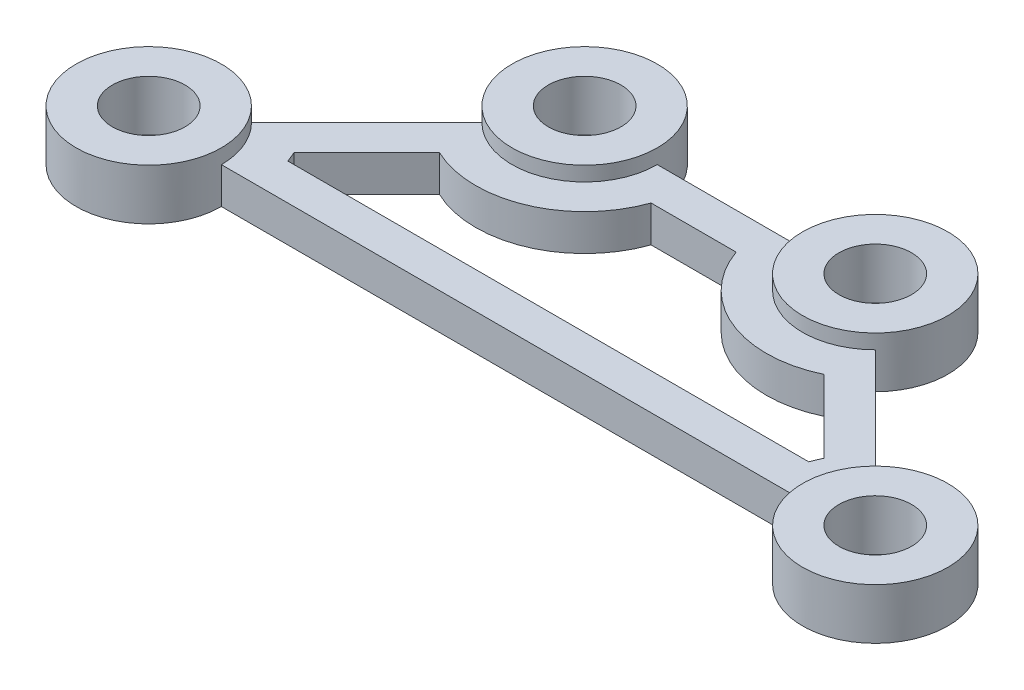
ISO-10303-21;
HEADER;
FILE_DESCRIPTION(('STEP AP214'),'2;1');
FILE_NAME('part.step','',(''),(''),'','','');
FILE_SCHEMA(('AUTOMOTIVE_DESIGN { 1 0 10303 214 1 1 1 1 }'));
ENDSEC;
DATA;
#1=APPLICATION_CONTEXT('core data for automotive mechanical design processes');
#2=APPLICATION_PROTOCOL_DEFINITION('international standard','automotive_design',2000,#1);
#3=PRODUCT_CONTEXT('',#1,'mechanical');
#4=PRODUCT('Part','Part','',(#3));
#5=PRODUCT_RELATED_PRODUCT_CATEGORY('part','',(#4));
#6=PRODUCT_DEFINITION_FORMATION('','',#4);
#7=PRODUCT_DEFINITION_CONTEXT('part definition',#1,'design');
#8=PRODUCT_DEFINITION('design','',#6,#7);
#9=PRODUCT_DEFINITION_SHAPE('','',#8);
#10=(LENGTH_UNIT() NAMED_UNIT(*) SI_UNIT(.MILLI.,.METRE.));
#11=(NAMED_UNIT(*) PLANE_ANGLE_UNIT() SI_UNIT($,.RADIAN.));
#12=(NAMED_UNIT(*) SI_UNIT($,.STERADIAN.) SOLID_ANGLE_UNIT());
#13=UNCERTAINTY_MEASURE_WITH_UNIT(LENGTH_MEASURE(1.E-05),#10,'distance_accuracy_value','');
#14=(GEOMETRIC_REPRESENTATION_CONTEXT(3) GLOBAL_UNCERTAINTY_ASSIGNED_CONTEXT((#13)) GLOBAL_UNIT_ASSIGNED_CONTEXT((#10,
#11,#12)) REPRESENTATION_CONTEXT('',''));
#15=CARTESIAN_POINT('',(0.,0.,0.));
#16=DIRECTION('',(0.,0.,1.));
#17=DIRECTION('',(1.,0.,0.));
#18=AXIS2_PLACEMENT_3D('',#15,#16,#17);
#19=CARTESIAN_POINT('',(0.,5.,0.));
#20=DIRECTION('',(0.,1.,0.));
#21=DIRECTION('',(0.,0.,1.));
#22=AXIS2_PLACEMENT_3D('',#19,#20,#21);
#23=PLANE('',#22);
#24=CARTESIAN_POINT('',(20.,5.,-9.99999999999967));
#25=DIRECTION('',(0.,1.,0.));
#26=DIRECTION('',(0.,0.,1.));
#27=AXIS2_PLACEMENT_3D('',#24,#25,#26);
#28=CIRCLE('',#27,15.);
#29=CARTESIAN_POINT('',(26.4644660940673,5.,3.53553390593303));
#30=VERTEX_POINT('',#29);
#31=CARTESIAN_POINT('',(5.85786437626904,5.,-4.99999999999968));
#32=VERTEX_POINT('',#31);
#33=EDGE_CURVE('E180',#30,#32,#28,.F.);
#34=ORIENTED_EDGE('',*,*,#33,.F.);
#35=DIRECTION('',(-0.707106781186551,0.,-0.707106781186544));
#36=VECTOR('',#35,1.);
#37=CARTESIAN_POINT('',(11.464466094067,5.,-11.4644660940671));
#38=LINE('',#37,#36);
#39=CARTESIAN_POINT('',(36.4644660940672,5.,13.5355339059328));
#40=VERTEX_POINT('',#39);
#41=EDGE_CURVE('E239',#40,#30,#38,.T.);
#42=ORIENTED_EDGE('',*,*,#41,.F.);
#43=CARTESIAN_POINT('',(50.,5.,20.));
#44=DIRECTION('',(0.,1.,0.));
#45=DIRECTION('',(0.,0.,1.));
#46=AXIS2_PLACEMENT_3D('',#43,#44,#45);
#47=CIRCLE('',#46,15.);
#48=CARTESIAN_POINT('',(35.8578643762691,5.,15.));
#49=VERTEX_POINT('',#48);
#50=EDGE_CURVE('E237',#49,#40,#47,.F.);
#51=ORIENTED_EDGE('',*,*,#50,.F.);
#52=DIRECTION('',(1.,0.,0.));
#53=VECTOR('',#52,1.);
#54=CARTESIAN_POINT('',(0.,5.,15.));
#55=LINE('',#54,#53);
#56=CARTESIAN_POINT('',(-35.8578643762691,5.,15.));
#57=VERTEX_POINT('',#56);
#58=EDGE_CURVE('E235',#57,#49,#55,.T.);
#59=ORIENTED_EDGE('',*,*,#58,.F.);
#60=CARTESIAN_POINT('',(-50.,5.,20.));
#61=DIRECTION('',(0.,1.,0.));
#62=DIRECTION('',(0.,0.,1.));
#63=AXIS2_PLACEMENT_3D('',#60,#61,#62);
#64=CIRCLE('',#63,15.);
#65=CARTESIAN_POINT('',(-36.4644660940672,5.,13.5355339059328));
#66=VERTEX_POINT('',#65);
#67=EDGE_CURVE('E233',#66,#57,#64,.F.);
#68=ORIENTED_EDGE('',*,*,#67,.F.);
#69=DIRECTION('',(-0.707106781186551,0.,0.707106781186544));
#70=VECTOR('',#69,1.);
#71=CARTESIAN_POINT('',(-11.464466094067,5.,-11.4644660940671));
#72=LINE('',#71,#70);
#73=CARTESIAN_POINT('',(-26.4644660940678,5.,3.53553390593349));
#74=VERTEX_POINT('',#73);
#75=EDGE_CURVE('E231',#74,#66,#72,.T.);
#76=ORIENTED_EDGE('',*,*,#75,.F.);
#77=CARTESIAN_POINT('',(-20.,5.,-9.99999999999968));
#78=DIRECTION('',(0.,1.,0.));
#79=DIRECTION('',(0.,0.,1.));
#80=AXIS2_PLACEMENT_3D('',#77,#78,#79);
#81=CIRCLE('',#80,15.0000000000006);
#82=CARTESIAN_POINT('',(-5.85786437626839,5.,-4.99999999999967));
#83=VERTEX_POINT('',#82);
#84=EDGE_CURVE('E229',#83,#74,#81,.F.);
#85=ORIENTED_EDGE('',*,*,#84,.F.);
#86=DIRECTION('',(-1.,0.,0.));
#87=VECTOR('',#86,1.);
#88=CARTESIAN_POINT('',(0.,5.,-4.99999999999968));
#89=LINE('',#88,#87);
#90=EDGE_CURVE('E211',#32,#83,#89,.T.);
#91=ORIENTED_EDGE('',*,*,#90,.F.);
#92=EDGE_LOOP('',(#34,#42,#51,#59,#68,#76,#85,#91));
#93=FACE_BOUND('',#92,.T.);
#94=DIRECTION('',(1.,0.,0.));
#95=VECTOR('',#94,1.);
#96=CARTESIAN_POINT('',(0.,5.,20.));
#97=LINE('',#96,#95);
#98=CARTESIAN_POINT('',(-40.,5.,20.));
#99=VERTEX_POINT('',#98);
#100=CARTESIAN_POINT('',(40.,5.,20.));
#101=VERTEX_POINT('',#100);
#102=EDGE_CURVE('E279',#99,#101,#97,.T.);
#103=ORIENTED_EDGE('',*,*,#102,.T.);
#104=CARTESIAN_POINT('',(50.,5.,20.));
#105=DIRECTION('',(0.,1.,0.));
#106=DIRECTION('',(0.,0.,1.));
#107=AXIS2_PLACEMENT_3D('',#104,#105,#106);
#108=CIRCLE('',#107,9.99999999999999);
#109=CARTESIAN_POINT('',(42.9289321881345,5.,12.9289321881346));
#110=VERTEX_POINT('',#109);
#111=EDGE_CURVE('E248',#101,#110,#108,.F.);
#112=ORIENTED_EDGE('',*,*,#111,.T.);
#113=DIRECTION('',(-0.707106781186552,0.,-0.707106781186544));
#114=VECTOR('',#113,1.);
#115=CARTESIAN_POINT('',(14.9999999999997,5.,-14.9999999999999));
#116=LINE('',#115,#114);
#117=CARTESIAN_POINT('',(27.0710678118655,5.,-2.92893218813424));
#118=VERTEX_POINT('',#117);
#119=EDGE_CURVE('E282',#110,#118,#116,.T.);
#120=ORIENTED_EDGE('',*,*,#119,.T.);
#121=CARTESIAN_POINT('',(20.,5.,-9.99999999999967));
#122=DIRECTION('',(0.,1.,0.));
#123=DIRECTION('',(0.,0.,1.));
#124=AXIS2_PLACEMENT_3D('',#121,#122,#123);
#125=CIRCLE('',#124,10.);
#126=CARTESIAN_POINT('',(9.99999999999999,5.,-9.99999999999968));
#127=VERTEX_POINT('',#126);
#128=EDGE_CURVE('E257',#118,#127,#125,.F.);
#129=ORIENTED_EDGE('',*,*,#128,.T.);
#130=DIRECTION('',(1.,0.,0.));
#131=VECTOR('',#130,1.);
#132=CARTESIAN_POINT('',(0.,5.,-9.99999999999968));
#133=LINE('',#132,#131);
#134=CARTESIAN_POINT('',(-9.99999999999938,5.,-9.99999999999968));
#135=VERTEX_POINT('',#134);
#136=EDGE_CURVE('E285',#135,#127,#133,.T.);
#137=ORIENTED_EDGE('',*,*,#136,.F.);
#138=CARTESIAN_POINT('',(-20.,5.,-9.99999999999968));
#139=DIRECTION('',(0.,1.,0.));
#140=DIRECTION('',(0.,0.,1.));
#141=AXIS2_PLACEMENT_3D('',#138,#139,#140);
#142=CIRCLE('',#141,10.0000000000006);
#143=CARTESIAN_POINT('',(-27.071067811866,5.,-2.9289321881338));
#144=VERTEX_POINT('',#143);
#145=EDGE_CURVE('E274',#135,#144,#142,.F.);
#146=ORIENTED_EDGE('',*,*,#145,.T.);
#147=DIRECTION('',(-0.707106781186551,0.,0.707106781186544));
#148=VECTOR('',#147,1.);
#149=CARTESIAN_POINT('',(-14.9999999999997,5.,-14.9999999999999));
#150=LINE('',#149,#148);
#151=CARTESIAN_POINT('',(-42.9289321881345,5.,12.9289321881346));
#152=VERTEX_POINT('',#151);
#153=EDGE_CURVE('E277',#144,#152,#150,.T.);
#154=ORIENTED_EDGE('',*,*,#153,.T.);
#155=CARTESIAN_POINT('',(-50.,5.,20.));
#156=DIRECTION('',(0.,1.,0.));
#157=DIRECTION('',(0.,0.,1.));
#158=AXIS2_PLACEMENT_3D('',#155,#156,#157);
#159=CIRCLE('',#158,10.);
#160=EDGE_CURVE('E265',#152,#99,#159,.F.);
#161=ORIENTED_EDGE('',*,*,#160,.T.);
#162=EDGE_LOOP('',(#103,#112,#120,#129,#137,#146,#154,#161));
#163=FACE_BOUND('',#162,.T.);
#164=ADVANCED_FACE('F61',(#93,#163),#23,.T.);
#165=CARTESIAN_POINT('',(-20.,5.,-9.99999999999968));
#166=DIRECTION('',(0.,-1.,0.));
#167=DIRECTION('',(0.,0.,-1.));
#168=AXIS2_PLACEMENT_3D('',#165,#166,#167);
#169=CYLINDRICAL_SURFACE('',#168,10.0000000000006);
#170=CARTESIAN_POINT('',(-20.,0.,-9.99999999999968));
#171=DIRECTION('',(0.,1.,0.));
#172=DIRECTION('',(0.,0.,1.));
#173=AXIS2_PLACEMENT_3D('',#170,#171,#172);
#174=CIRCLE('',#173,10.0000000000006);
#175=CARTESIAN_POINT('',(-9.99999999999938,0.,-9.99999999999968));
#176=VERTEX_POINT('',#175);
#177=CARTESIAN_POINT('',(-27.071067811866,0.,-2.9289321881338));
#178=VERTEX_POINT('',#177);
#179=EDGE_CURVE('E291',#176,#178,#174,.T.);
#180=ORIENTED_EDGE('',*,*,#179,.T.);
#181=DIRECTION('',(0.,-1.,0.));
#182=VECTOR('',#181,1.);
#183=CARTESIAN_POINT('',(-27.071067811866,5.,-2.9289321881338));
#184=LINE('',#183,#182);
#185=EDGE_CURVE('E12',#144,#178,#184,.T.);
#186=ORIENTED_EDGE('',*,*,#185,.F.);
#187=ORIENTED_EDGE('',*,*,#145,.F.);
#188=DIRECTION('',(0.,-1.,0.));
#189=VECTOR('',#188,1.);
#190=CARTESIAN_POINT('',(-9.99999999999938,5.,-9.99999999999968));
#191=LINE('',#190,#189);
#192=EDGE_CURVE('E288',#135,#176,#191,.T.);
#193=ORIENTED_EDGE('',*,*,#192,.T.);
#194=EDGE_LOOP('',(#180,#186,#187,#193));
#195=FACE_BOUND('',#194,.T.);
#196=CARTESIAN_POINT('',(-20.,7.,-9.99999999999968));
#197=DIRECTION('',(0.,1.,0.));
#198=DIRECTION('',(0.,0.,1.));
#199=AXIS2_PLACEMENT_3D('',#196,#197,#198);
#200=CIRCLE('',#199,10.0000000000006);
#201=CARTESIAN_POINT('',(-20.,7.,9.47159017883337E-13));
#202=VERTEX_POINT('',#201);
#203=EDGE_CURVE('E271',#202,#202,#200,.T.);
#204=ORIENTED_EDGE('',*,*,#203,.F.);
#205=EDGE_LOOP('',(#204));
#206=FACE_BOUND('',#205,.T.);
#207=ADVANCED_FACE('F361',(#195,#206),#169,.T.);
#208=CARTESIAN_POINT('',(-14.9999999999997,5.,-14.9999999999999));
#209=DIRECTION('',(0.707106781186544,0.,0.707106781186551));
#210=DIRECTION('',(0.707106781186551,0.,-0.707106781186544));
#211=AXIS2_PLACEMENT_3D('',#208,#209,#210);
#212=PLANE('',#211);
#213=DIRECTION('',(-0.707106781186551,0.,0.707106781186544));
#214=VECTOR('',#213,1.);
#215=CARTESIAN_POINT('',(-14.9999999999997,0.,-14.9999999999999));
#216=LINE('',#215,#214);
#217=CARTESIAN_POINT('',(-42.9289321881345,0.,12.9289321881346));
#218=VERTEX_POINT('',#217);
#219=EDGE_CURVE('E294',#178,#218,#216,.T.);
#220=ORIENTED_EDGE('',*,*,#219,.T.);
#221=DIRECTION('',(0.,-1.,0.));
#222=VECTOR('',#221,1.);
#223=CARTESIAN_POINT('',(-42.9289321881345,5.,12.9289321881346));
#224=LINE('',#223,#222);
#225=EDGE_CURVE('E69',#152,#218,#224,.T.);
#226=ORIENTED_EDGE('',*,*,#225,.F.);
#227=ORIENTED_EDGE('',*,*,#153,.F.);
#228=ORIENTED_EDGE('',*,*,#185,.T.);
#229=EDGE_LOOP('',(#220,#226,#227,#228));
#230=FACE_BOUND('',#229,.T.);
#231=ADVANCED_FACE('F359',(#230),#212,.F.);
#232=CARTESIAN_POINT('',(-50.,5.,20.));
#233=DIRECTION('',(0.,-1.,0.));
#234=DIRECTION('',(0.,0.,-1.));
#235=AXIS2_PLACEMENT_3D('',#232,#233,#234);
#236=CYLINDRICAL_SURFACE('',#235,10.);
#237=CARTESIAN_POINT('',(-50.,0.,20.));
#238=DIRECTION('',(0.,1.,0.));
#239=DIRECTION('',(0.,0.,1.));
#240=AXIS2_PLACEMENT_3D('',#237,#238,#239);
#241=CIRCLE('',#240,10.);
#242=CARTESIAN_POINT('',(-40.,0.,20.));
#243=VERTEX_POINT('',#242);
#244=EDGE_CURVE('E296',#218,#243,#241,.T.);
#245=ORIENTED_EDGE('',*,*,#244,.T.);
#246=DIRECTION('',(0.,-1.,0.));
#247=VECTOR('',#246,1.);
#248=CARTESIAN_POINT('',(-40.,5.,20.));
#249=LINE('',#248,#247);
#250=EDGE_CURVE('E330',#99,#243,#249,.T.);
#251=ORIENTED_EDGE('',*,*,#250,.F.);
#252=ORIENTED_EDGE('',*,*,#160,.F.);
#253=ORIENTED_EDGE('',*,*,#225,.T.);
#254=EDGE_LOOP('',(#245,#251,#252,#253));
#255=FACE_BOUND('',#254,.T.);
#256=CARTESIAN_POINT('',(-50.,7.,20.));
#257=DIRECTION('',(0.,1.,0.));
#258=DIRECTION('',(0.,0.,1.));
#259=AXIS2_PLACEMENT_3D('',#256,#257,#258);
#260=CIRCLE('',#259,10.);
#261=CARTESIAN_POINT('',(-50.,7.,30.));
#262=VERTEX_POINT('',#261);
#263=EDGE_CURVE('E259',#262,#262,#260,.T.);
#264=ORIENTED_EDGE('',*,*,#263,.F.);
#265=EDGE_LOOP('',(#264));
#266=FACE_BOUND('',#265,.T.);
#267=ADVANCED_FACE('F337',(#255,#266),#236,.T.);
#268=CARTESIAN_POINT('',(0.,5.,20.));
#269=DIRECTION('',(0.,0.,-1.));
#270=DIRECTION('',(-1.,0.,0.));
#271=AXIS2_PLACEMENT_3D('',#268,#269,#270);
#272=PLANE('',#271);
#273=DIRECTION('',(1.,0.,0.));
#274=VECTOR('',#273,1.);
#275=CARTESIAN_POINT('',(0.,0.,20.));
#276=LINE('',#275,#274);
#277=CARTESIAN_POINT('',(40.,0.,20.));
#278=VERTEX_POINT('',#277);
#279=EDGE_CURVE('E298',#243,#278,#276,.T.);
#280=ORIENTED_EDGE('',*,*,#279,.T.);
#281=DIRECTION('',(0.,-1.,0.));
#282=VECTOR('',#281,1.);
#283=CARTESIAN_POINT('',(40.,5.,20.));
#284=LINE('',#283,#282);
#285=EDGE_CURVE('E327',#101,#278,#284,.T.);
#286=ORIENTED_EDGE('',*,*,#285,.F.);
#287=ORIENTED_EDGE('',*,*,#102,.F.);
#288=ORIENTED_EDGE('',*,*,#250,.T.);
#289=EDGE_LOOP('',(#280,#286,#287,#288));
#290=FACE_BOUND('',#289,.T.);
#291=ADVANCED_FACE('F349',(#290),#272,.F.);
#292=CARTESIAN_POINT('',(50.,5.,20.));
#293=DIRECTION('',(0.,-1.,0.));
#294=DIRECTION('',(0.,0.,-1.));
#295=AXIS2_PLACEMENT_3D('',#292,#293,#294);
#296=CYLINDRICAL_SURFACE('',#295,9.99999999999999);
#297=CARTESIAN_POINT('',(50.,0.,20.));
#298=DIRECTION('',(0.,1.,0.));
#299=DIRECTION('',(0.,0.,1.));
#300=AXIS2_PLACEMENT_3D('',#297,#298,#299);
#301=CIRCLE('',#300,9.99999999999999);
#302=CARTESIAN_POINT('',(42.9289321881345,0.,12.9289321881346));
#303=VERTEX_POINT('',#302);
#304=EDGE_CURVE('E300',#278,#303,#301,.T.);
#305=ORIENTED_EDGE('',*,*,#304,.T.);
#306=DIRECTION('',(0.,-1.,0.));
#307=VECTOR('',#306,1.);
#308=CARTESIAN_POINT('',(42.9289321881345,5.,12.9289321881346));
#309=LINE('',#308,#307);
#310=EDGE_CURVE('E324',#110,#303,#309,.T.);
#311=ORIENTED_EDGE('',*,*,#310,.F.);
#312=ORIENTED_EDGE('',*,*,#111,.F.);
#313=ORIENTED_EDGE('',*,*,#285,.T.);
#314=EDGE_LOOP('',(#305,#311,#312,#313));
#315=FACE_BOUND('',#314,.T.);
#316=CARTESIAN_POINT('',(50.,7.,20.));
#317=DIRECTION('',(0.,1.,0.));
#318=DIRECTION('',(0.,0.,1.));
#319=AXIS2_PLACEMENT_3D('',#316,#317,#318);
#320=CIRCLE('',#319,9.99999999999999);
#321=CARTESIAN_POINT('',(50.,7.,30.));
#322=VERTEX_POINT('',#321);
#323=EDGE_CURVE('E242',#322,#322,#320,.T.);
#324=ORIENTED_EDGE('',*,*,#323,.F.);
#325=EDGE_LOOP('',(#324));
#326=FACE_BOUND('',#325,.T.);
#327=ADVANCED_FACE('F352',(#315,#326),#296,.T.);
#328=CARTESIAN_POINT('',(14.9999999999997,5.,-14.9999999999999));
#329=DIRECTION('',(-0.707106781186544,0.,0.707106781186552));
#330=DIRECTION('',(0.707106781186552,0.,0.707106781186544));
#331=AXIS2_PLACEMENT_3D('',#328,#329,#330);
#332=PLANE('',#331);
#333=DIRECTION('',(-0.707106781186552,0.,-0.707106781186544));
#334=VECTOR('',#333,1.);
#335=CARTESIAN_POINT('',(14.9999999999997,0.,-14.9999999999999));
#336=LINE('',#335,#334);
#337=CARTESIAN_POINT('',(27.0710678118655,0.,-2.92893218813424));
#338=VERTEX_POINT('',#337);
#339=EDGE_CURVE('E302',#303,#338,#336,.T.);
#340=ORIENTED_EDGE('',*,*,#339,.T.);
#341=DIRECTION('',(0.,-1.,0.));
#342=VECTOR('',#341,1.);
#343=CARTESIAN_POINT('',(27.0710678118655,5.,-2.92893218813424));
#344=LINE('',#343,#342);
#345=EDGE_CURVE('E321',#118,#338,#344,.T.);
#346=ORIENTED_EDGE('',*,*,#345,.F.);
#347=ORIENTED_EDGE('',*,*,#119,.F.);
#348=ORIENTED_EDGE('',*,*,#310,.T.);
#349=EDGE_LOOP('',(#340,#346,#347,#348));
#350=FACE_BOUND('',#349,.T.);
#351=ADVANCED_FACE('F373',(#350),#332,.F.);
#352=CARTESIAN_POINT('',(20.,5.,-9.99999999999967));
#353=DIRECTION('',(0.,-1.,0.));
#354=DIRECTION('',(0.,0.,-1.));
#355=AXIS2_PLACEMENT_3D('',#352,#353,#354);
#356=CYLINDRICAL_SURFACE('',#355,10.);
#357=CARTESIAN_POINT('',(20.,0.,-9.99999999999967));
#358=DIRECTION('',(0.,1.,0.));
#359=DIRECTION('',(0.,0.,1.));
#360=AXIS2_PLACEMENT_3D('',#357,#358,#359);
#361=CIRCLE('',#360,10.);
#362=CARTESIAN_POINT('',(9.99999999999999,0.,-9.99999999999968));
#363=VERTEX_POINT('',#362);
#364=EDGE_CURVE('E304',#338,#363,#361,.T.);
#365=ORIENTED_EDGE('',*,*,#364,.T.);
#366=DIRECTION('',(0.,-1.,0.));
#367=VECTOR('',#366,1.);
#368=CARTESIAN_POINT('',(9.99999999999999,5.,-9.99999999999968));
#369=LINE('',#368,#367);
#370=EDGE_CURVE('E319',#127,#363,#369,.T.);
#371=ORIENTED_EDGE('',*,*,#370,.F.);
#372=ORIENTED_EDGE('',*,*,#128,.F.);
#373=ORIENTED_EDGE('',*,*,#345,.T.);
#374=EDGE_LOOP('',(#365,#371,#372,#373));
#375=FACE_BOUND('',#374,.T.);
#376=CARTESIAN_POINT('',(20.,7.,-9.99999999999967));
#377=DIRECTION('',(0.,1.,0.));
#378=DIRECTION('',(0.,0.,1.));
#379=AXIS2_PLACEMENT_3D('',#376,#377,#378);
#380=CIRCLE('',#379,10.);
#381=CARTESIAN_POINT('',(20.,7.,3.27862736959617E-13));
#382=VERTEX_POINT('',#381);
#383=EDGE_CURVE('E251',#382,#382,#380,.T.);
#384=ORIENTED_EDGE('',*,*,#383,.F.);
#385=EDGE_LOOP('',(#384));
#386=FACE_BOUND('',#385,.T.);
#387=ADVANCED_FACE('F370',(#375,#386),#356,.T.);
#388=CARTESIAN_POINT('',(50.,5.,20.));
#389=DIRECTION('',(0.,-1.,0.));
#390=DIRECTION('',(0.,0.,-1.));
#391=AXIS2_PLACEMENT_3D('',#388,#389,#390);
#392=CYLINDRICAL_SURFACE('',#391,4.99999999999998);
#393=CARTESIAN_POINT('',(50.,0.,20.));
#394=DIRECTION('',(0.,1.,0.));
#395=DIRECTION('',(0.,0.,1.));
#396=AXIS2_PLACEMENT_3D('',#393,#394,#395);
#397=CIRCLE('',#396,4.99999999999998);
#398=CARTESIAN_POINT('',(50.,0.,25.));
#399=VERTEX_POINT('',#398);
#400=EDGE_CURVE('E313',#399,#399,#397,.T.);
#401=ORIENTED_EDGE('',*,*,#400,.F.);
#402=EDGE_LOOP('',(#401));
#403=FACE_BOUND('',#402,.T.);
#404=CARTESIAN_POINT('',(50.,7.,20.));
#405=DIRECTION('',(0.,1.,0.));
#406=DIRECTION('',(0.,0.,1.));
#407=AXIS2_PLACEMENT_3D('',#404,#405,#406);
#408=CIRCLE('',#407,4.99999999999998);
#409=CARTESIAN_POINT('',(50.,7.,25.));
#410=VERTEX_POINT('',#409);
#411=EDGE_CURVE('E245',#410,#410,#408,.T.);
#412=ORIENTED_EDGE('',*,*,#411,.T.);
#413=EDGE_LOOP('',(#412));
#414=FACE_BOUND('',#413,.T.);
#415=ADVANCED_FACE('F380',(#403,#414),#392,.F.);
#416=CARTESIAN_POINT('',(-20.,5.,-9.99999999999968));
#417=DIRECTION('',(0.,-1.,0.));
#418=DIRECTION('',(0.,0.,-1.));
#419=AXIS2_PLACEMENT_3D('',#416,#417,#418);
#420=CYLINDRICAL_SURFACE('',#419,5.00000000000062);
#421=CARTESIAN_POINT('',(-20.,0.,-9.99999999999968));
#422=DIRECTION('',(0.,1.,0.));
#423=DIRECTION('',(0.,0.,1.));
#424=AXIS2_PLACEMENT_3D('',#421,#422,#423);
#425=CIRCLE('',#424,5.00000000000062);
#426=CARTESIAN_POINT('',(-20.,0.,-4.99999999999906));
#427=VERTEX_POINT('',#426);
#428=EDGE_CURVE('E310',#427,#427,#425,.T.);
#429=ORIENTED_EDGE('',*,*,#428,.F.);
#430=EDGE_LOOP('',(#429));
#431=FACE_BOUND('',#430,.T.);
#432=CARTESIAN_POINT('',(-20.,7.,-9.99999999999968));
#433=DIRECTION('',(0.,1.,0.));
#434=DIRECTION('',(0.,0.,1.));
#435=AXIS2_PLACEMENT_3D('',#432,#433,#434);
#436=CIRCLE('',#435,5.00000000000062);
#437=CARTESIAN_POINT('',(-20.,7.,-4.99999999999906));
#438=VERTEX_POINT('',#437);
#439=EDGE_CURVE('E268',#438,#438,#436,.T.);
#440=ORIENTED_EDGE('',*,*,#439,.T.);
#441=EDGE_LOOP('',(#440));
#442=FACE_BOUND('',#441,.T.);
#443=ADVANCED_FACE('F401',(#431,#442),#420,.F.);
#444=CARTESIAN_POINT('',(0.,5.,-9.99999999999968));
#445=DIRECTION('',(0.,0.,-1.));
#446=DIRECTION('',(-1.,0.,0.));
#447=AXIS2_PLACEMENT_3D('',#444,#445,#446);
#448=PLANE('',#447);
#449=DIRECTION('',(1.,0.,0.));
#450=VECTOR('',#449,1.);
#451=CARTESIAN_POINT('',(0.,0.,-9.99999999999968));
#452=LINE('',#451,#450);
#453=EDGE_CURVE('E307',#176,#363,#452,.T.);
#454=ORIENTED_EDGE('',*,*,#453,.F.);
#455=ORIENTED_EDGE('',*,*,#192,.F.);
#456=ORIENTED_EDGE('',*,*,#136,.T.);
#457=ORIENTED_EDGE('',*,*,#370,.T.);
#458=EDGE_LOOP('',(#454,#455,#456,#457));
#459=FACE_BOUND('',#458,.T.);
#460=ADVANCED_FACE('F367',(#459),#448,.T.);
#461=CARTESIAN_POINT('',(20.,5.,-9.99999999999967));
#462=DIRECTION('',(0.,-1.,0.));
#463=DIRECTION('',(0.,0.,-1.));
#464=AXIS2_PLACEMENT_3D('',#461,#462,#463);
#465=CYLINDRICAL_SURFACE('',#464,5.);
#466=CARTESIAN_POINT('',(20.,0.,-9.99999999999967));
#467=DIRECTION('',(0.,1.,0.));
#468=DIRECTION('',(0.,0.,1.));
#469=AXIS2_PLACEMENT_3D('',#466,#467,#468);
#470=CIRCLE('',#469,5.);
#471=CARTESIAN_POINT('',(20.,0.,-4.99999999999967));
#472=VERTEX_POINT('',#471);
#473=EDGE_CURVE('E276',#472,#472,#470,.T.);
#474=ORIENTED_EDGE('',*,*,#473,.F.);
#475=EDGE_LOOP('',(#474));
#476=FACE_BOUND('',#475,.T.);
#477=CARTESIAN_POINT('',(20.,7.,-9.99999999999967));
#478=DIRECTION('',(0.,1.,0.));
#479=DIRECTION('',(0.,0.,1.));
#480=AXIS2_PLACEMENT_3D('',#477,#478,#479);
#481=CIRCLE('',#480,5.);
#482=CARTESIAN_POINT('',(20.,7.,-4.99999999999967));
#483=VERTEX_POINT('',#482);
#484=EDGE_CURVE('E254',#483,#483,#481,.T.);
#485=ORIENTED_EDGE('',*,*,#484,.T.);
#486=EDGE_LOOP('',(#485));
#487=FACE_BOUND('',#486,.T.);
#488=ADVANCED_FACE('F63',(#476,#487),#465,.F.);
#489=CARTESIAN_POINT('',(-50.,5.,20.));
#490=DIRECTION('',(0.,-1.,0.));
#491=DIRECTION('',(0.,0.,-1.));
#492=AXIS2_PLACEMENT_3D('',#489,#490,#491);
#493=CYLINDRICAL_SURFACE('',#492,5.);
#494=CARTESIAN_POINT('',(-50.,0.,20.));
#495=DIRECTION('',(0.,1.,0.));
#496=DIRECTION('',(0.,0.,1.));
#497=AXIS2_PLACEMENT_3D('',#494,#495,#496);
#498=CIRCLE('',#497,5.);
#499=CARTESIAN_POINT('',(-50.,0.,25.));
#500=VERTEX_POINT('',#499);
#501=EDGE_CURVE('E280',#500,#500,#498,.T.);
#502=ORIENTED_EDGE('',*,*,#501,.F.);
#503=EDGE_LOOP('',(#502));
#504=FACE_BOUND('',#503,.T.);
#505=CARTESIAN_POINT('',(-50.,7.,20.));
#506=DIRECTION('',(0.,1.,0.));
#507=DIRECTION('',(0.,0.,1.));
#508=AXIS2_PLACEMENT_3D('',#505,#506,#507);
#509=CIRCLE('',#508,5.);
#510=CARTESIAN_POINT('',(-50.,7.,25.));
#511=VERTEX_POINT('',#510);
#512=EDGE_CURVE('E262',#511,#511,#509,.T.);
#513=ORIENTED_EDGE('',*,*,#512,.T.);
#514=EDGE_LOOP('',(#513));
#515=FACE_BOUND('',#514,.T.);
#516=ADVANCED_FACE('F395',(#504,#515),#493,.F.);
#517=CARTESIAN_POINT('',(0.,0.,0.));
#518=DIRECTION('',(0.,1.,0.));
#519=DIRECTION('',(0.,0.,1.));
#520=AXIS2_PLACEMENT_3D('',#517,#518,#519);
#521=PLANE('',#520);
#522=DIRECTION('',(-0.707106781186551,0.,-0.707106781186544));
#523=VECTOR('',#522,1.);
#524=CARTESIAN_POINT('',(36.4644660940672,0.,13.5355339059328));
#525=LINE('',#524,#523);
#526=CARTESIAN_POINT('',(36.4644660940672,0.,13.5355339059328));
#527=VERTEX_POINT('',#526);
#528=CARTESIAN_POINT('',(26.4644660940673,0.,3.53553390593303));
#529=VERTEX_POINT('',#528);
#530=EDGE_CURVE('E183',#527,#529,#525,.T.);
#531=ORIENTED_EDGE('',*,*,#530,.T.);
#532=CARTESIAN_POINT('',(20.,0.,-9.99999999999967));
#533=DIRECTION('',(0.,-1.,0.));
#534=DIRECTION('',(0.,0.,1.));
#535=AXIS2_PLACEMENT_3D('',#532,#533,#534);
#536=CIRCLE('',#535,15.);
#537=CARTESIAN_POINT('',(5.85786437626904,0.,-4.99999999999968));
#538=VERTEX_POINT('',#537);
#539=EDGE_CURVE('E177',#529,#538,#536,.T.);
#540=ORIENTED_EDGE('',*,*,#539,.T.);
#541=DIRECTION('',(-1.,0.,0.));
#542=VECTOR('',#541,1.);
#543=CARTESIAN_POINT('',(5.85786437626904,0.,-4.99999999999968));
#544=LINE('',#543,#542);
#545=CARTESIAN_POINT('',(-5.85786437626839,0.,-4.99999999999968));
#546=VERTEX_POINT('',#545);
#547=EDGE_CURVE('E186',#538,#546,#544,.T.);
#548=ORIENTED_EDGE('',*,*,#547,.T.);
#549=CARTESIAN_POINT('',(-20.,0.,-9.99999999999968));
#550=DIRECTION('',(0.,-1.,0.));
#551=DIRECTION('',(0.,0.,1.));
#552=AXIS2_PLACEMENT_3D('',#549,#550,#551);
#553=CIRCLE('',#552,15.0000000000006);
#554=CARTESIAN_POINT('',(-26.4644660940678,0.,3.53553390593349));
#555=VERTEX_POINT('',#554);
#556=EDGE_CURVE('E84',#546,#555,#553,.T.);
#557=ORIENTED_EDGE('',*,*,#556,.T.);
#558=DIRECTION('',(-0.707106781186551,0.,0.707106781186544));
#559=VECTOR('',#558,1.);
#560=CARTESIAN_POINT('',(-26.4644660940678,0.,3.53553390593349));
#561=LINE('',#560,#559);
#562=CARTESIAN_POINT('',(-36.4644660940672,0.,13.5355339059328));
#563=VERTEX_POINT('',#562);
#564=EDGE_CURVE('E197',#555,#563,#561,.T.);
#565=ORIENTED_EDGE('',*,*,#564,.T.);
#566=CARTESIAN_POINT('',(-50.,0.,20.));
#567=DIRECTION('',(0.,-1.,0.));
#568=DIRECTION('',(0.,0.,1.));
#569=AXIS2_PLACEMENT_3D('',#566,#567,#568);
#570=CIRCLE('',#569,15.);
#571=CARTESIAN_POINT('',(-35.8578643762691,0.,15.));
#572=VERTEX_POINT('',#571);
#573=EDGE_CURVE('E200',#563,#572,#570,.T.);
#574=ORIENTED_EDGE('',*,*,#573,.T.);
#575=DIRECTION('',(1.,0.,0.));
#576=VECTOR('',#575,1.);
#577=CARTESIAN_POINT('',(-35.8578643762691,0.,15.));
#578=LINE('',#577,#576);
#579=CARTESIAN_POINT('',(35.8578643762691,0.,15.));
#580=VERTEX_POINT('',#579);
#581=EDGE_CURVE('E203',#572,#580,#578,.T.);
#582=ORIENTED_EDGE('',*,*,#581,.T.);
#583=CARTESIAN_POINT('',(50.,0.,20.));
#584=DIRECTION('',(0.,-1.,0.));
#585=DIRECTION('',(0.,0.,1.));
#586=AXIS2_PLACEMENT_3D('',#583,#584,#585);
#587=CIRCLE('',#586,15.);
#588=EDGE_CURVE('E206',#580,#527,#587,.T.);
#589=ORIENTED_EDGE('',*,*,#588,.T.);
#590=EDGE_LOOP('',(#531,#540,#548,#557,#565,#574,#582,#589));
#591=FACE_BOUND('',#590,.T.);
#592=ORIENTED_EDGE('',*,*,#304,.F.);
#593=ORIENTED_EDGE('',*,*,#279,.F.);
#594=ORIENTED_EDGE('',*,*,#244,.F.);
#595=ORIENTED_EDGE('',*,*,#219,.F.);
#596=ORIENTED_EDGE('',*,*,#179,.F.);
#597=ORIENTED_EDGE('',*,*,#453,.T.);
#598=ORIENTED_EDGE('',*,*,#364,.F.);
#599=ORIENTED_EDGE('',*,*,#339,.F.);
#600=EDGE_LOOP('',(#592,#593,#594,#595,#596,#597,#598,#599));
#601=FACE_BOUND('',#600,.T.);
#602=ORIENTED_EDGE('',*,*,#400,.T.);
#603=EDGE_LOOP('',(#602));
#604=FACE_BOUND('',#603,.T.);
#605=ORIENTED_EDGE('',*,*,#501,.T.);
#606=EDGE_LOOP('',(#605));
#607=FACE_BOUND('',#606,.T.);
#608=ORIENTED_EDGE('',*,*,#428,.T.);
#609=EDGE_LOOP('',(#608));
#610=FACE_BOUND('',#609,.T.);
#611=ORIENTED_EDGE('',*,*,#473,.T.);
#612=EDGE_LOOP('',(#611));
#613=FACE_BOUND('',#612,.T.);
#614=ADVANCED_FACE('F190',(#591,#601,#604,#607,#610,#613),#521,.F.);
#615=CARTESIAN_POINT('',(-20.,7.,-9.99999999999968));
#616=DIRECTION('',(0.,1.,0.));
#617=DIRECTION('',(0.,0.,1.));
#618=AXIS2_PLACEMENT_3D('',#615,#616,#617);
#619=PLANE('',#618);
#620=ORIENTED_EDGE('',*,*,#203,.T.);
#621=EDGE_LOOP('',(#620));
#622=FACE_BOUND('',#621,.T.);
#623=ORIENTED_EDGE('',*,*,#439,.F.);
#624=EDGE_LOOP('',(#623));
#625=FACE_BOUND('',#624,.T.);
#626=ADVANCED_FACE('F391',(#622,#625),#619,.T.);
#627=CARTESIAN_POINT('',(-50.,7.,20.));
#628=DIRECTION('',(0.,1.,0.));
#629=DIRECTION('',(0.,0.,1.));
#630=AXIS2_PLACEMENT_3D('',#627,#628,#629);
#631=PLANE('',#630);
#632=ORIENTED_EDGE('',*,*,#263,.T.);
#633=EDGE_LOOP('',(#632));
#634=FACE_BOUND('',#633,.T.);
#635=ORIENTED_EDGE('',*,*,#512,.F.);
#636=EDGE_LOOP('',(#635));
#637=FACE_BOUND('',#636,.T.);
#638=ADVANCED_FACE('F420',(#634,#637),#631,.T.);
#639=CARTESIAN_POINT('',(20.,7.,-9.99999999999967));
#640=DIRECTION('',(0.,1.,0.));
#641=DIRECTION('',(0.,0.,1.));
#642=AXIS2_PLACEMENT_3D('',#639,#640,#641);
#643=PLANE('',#642);
#644=ORIENTED_EDGE('',*,*,#383,.T.);
#645=EDGE_LOOP('',(#644));
#646=FACE_BOUND('',#645,.T.);
#647=ORIENTED_EDGE('',*,*,#484,.F.);
#648=EDGE_LOOP('',(#647));
#649=FACE_BOUND('',#648,.T.);
#650=ADVANCED_FACE('F417',(#646,#649),#643,.T.);
#651=CARTESIAN_POINT('',(50.,7.,20.));
#652=DIRECTION('',(0.,1.,0.));
#653=DIRECTION('',(0.,0.,1.));
#654=AXIS2_PLACEMENT_3D('',#651,#652,#653);
#655=PLANE('',#654);
#656=ORIENTED_EDGE('',*,*,#323,.T.);
#657=EDGE_LOOP('',(#656));
#658=FACE_BOUND('',#657,.T.);
#659=ORIENTED_EDGE('',*,*,#411,.F.);
#660=EDGE_LOOP('',(#659));
#661=FACE_BOUND('',#660,.T.);
#662=ADVANCED_FACE('F419',(#658,#661),#655,.T.);
#663=CARTESIAN_POINT('',(20.,0.,-9.99999999999967));
#664=DIRECTION('',(0.,1.,0.));
#665=DIRECTION('',(0.,0.,1.));
#666=AXIS2_PLACEMENT_3D('',#663,#664,#665);
#667=CYLINDRICAL_SURFACE('',#666,15.);
#668=ORIENTED_EDGE('',*,*,#33,.T.);
#669=DIRECTION('',(0.,1.,0.));
#670=VECTOR('',#669,1.);
#671=CARTESIAN_POINT('',(5.85786437626904,0.,-4.99999999999968));
#672=LINE('',#671,#670);
#673=EDGE_CURVE('E76',#538,#32,#672,.T.);
#674=ORIENTED_EDGE('',*,*,#673,.F.);
#675=ORIENTED_EDGE('',*,*,#539,.F.);
#676=DIRECTION('',(0.,1.,0.));
#677=VECTOR('',#676,1.);
#678=CARTESIAN_POINT('',(26.4644660940673,0.,3.53553390593303));
#679=LINE('',#678,#677);
#680=EDGE_CURVE('E209',#529,#30,#679,.T.);
#681=ORIENTED_EDGE('',*,*,#680,.T.);
#682=EDGE_LOOP('',(#668,#674,#675,#681));
#683=FACE_BOUND('',#682,.T.);
#684=ADVANCED_FACE('F174',(#683),#667,.T.);
#685=CARTESIAN_POINT('',(36.4644660940672,0.,13.5355339059328));
#686=DIRECTION('',(0.707106781186544,0.,-0.707106781186551));
#687=DIRECTION('',(-0.707106781186551,0.,-0.707106781186544));
#688=AXIS2_PLACEMENT_3D('',#685,#686,#687);
#689=PLANE('',#688);
#690=ORIENTED_EDGE('',*,*,#41,.T.);
#691=ORIENTED_EDGE('',*,*,#680,.F.);
#692=ORIENTED_EDGE('',*,*,#530,.F.);
#693=DIRECTION('',(0.,1.,0.));
#694=VECTOR('',#693,1.);
#695=CARTESIAN_POINT('',(36.4644660940672,0.,13.5355339059328));
#696=LINE('',#695,#694);
#697=EDGE_CURVE('E212',#527,#40,#696,.T.);
#698=ORIENTED_EDGE('',*,*,#697,.T.);
#699=EDGE_LOOP('',(#690,#691,#692,#698));
#700=FACE_BOUND('',#699,.T.);
#701=ADVANCED_FACE('F433',(#700),#689,.F.);
#702=CARTESIAN_POINT('',(50.,0.,20.));
#703=DIRECTION('',(0.,1.,0.));
#704=DIRECTION('',(0.,0.,1.));
#705=AXIS2_PLACEMENT_3D('',#702,#703,#704);
#706=CYLINDRICAL_SURFACE('',#705,15.);
#707=ORIENTED_EDGE('',*,*,#50,.T.);
#708=ORIENTED_EDGE('',*,*,#697,.F.);
#709=ORIENTED_EDGE('',*,*,#588,.F.);
#710=DIRECTION('',(0.,1.,0.));
#711=VECTOR('',#710,1.);
#712=CARTESIAN_POINT('',(35.8578643762691,0.,15.));
#713=LINE('',#712,#711);
#714=EDGE_CURVE('E215',#580,#49,#713,.T.);
#715=ORIENTED_EDGE('',*,*,#714,.T.);
#716=EDGE_LOOP('',(#707,#708,#709,#715));
#717=FACE_BOUND('',#716,.T.);
#718=ADVANCED_FACE('F450',(#717),#706,.T.);
#719=CARTESIAN_POINT('',(-35.8578643762691,0.,15.));
#720=DIRECTION('',(0.,0.,1.));
#721=DIRECTION('',(1.,0.,0.));
#722=AXIS2_PLACEMENT_3D('',#719,#720,#721);
#723=PLANE('',#722);
#724=ORIENTED_EDGE('',*,*,#58,.T.);
#725=ORIENTED_EDGE('',*,*,#714,.F.);
#726=ORIENTED_EDGE('',*,*,#581,.F.);
#727=DIRECTION('',(0.,1.,0.));
#728=VECTOR('',#727,1.);
#729=CARTESIAN_POINT('',(-35.8578643762691,0.,15.));
#730=LINE('',#729,#728);
#731=EDGE_CURVE('E218',#572,#57,#730,.T.);
#732=ORIENTED_EDGE('',*,*,#731,.T.);
#733=EDGE_LOOP('',(#724,#725,#726,#732));
#734=FACE_BOUND('',#733,.T.);
#735=ADVANCED_FACE('F446',(#734),#723,.F.);
#736=CARTESIAN_POINT('',(-50.,0.,20.));
#737=DIRECTION('',(0.,1.,0.));
#738=DIRECTION('',(0.,0.,1.));
#739=AXIS2_PLACEMENT_3D('',#736,#737,#738);
#740=CYLINDRICAL_SURFACE('',#739,15.);
#741=ORIENTED_EDGE('',*,*,#67,.T.);
#742=ORIENTED_EDGE('',*,*,#731,.F.);
#743=ORIENTED_EDGE('',*,*,#573,.F.);
#744=DIRECTION('',(0.,1.,0.));
#745=VECTOR('',#744,1.);
#746=CARTESIAN_POINT('',(-36.4644660940672,0.,13.5355339059328));
#747=LINE('',#746,#745);
#748=EDGE_CURVE('E221',#563,#66,#747,.T.);
#749=ORIENTED_EDGE('',*,*,#748,.T.);
#750=EDGE_LOOP('',(#741,#742,#743,#749));
#751=FACE_BOUND('',#750,.T.);
#752=ADVANCED_FACE('F442',(#751),#740,.T.);
#753=CARTESIAN_POINT('',(-26.4644660940678,0.,3.53553390593349));
#754=DIRECTION('',(-0.707106781186544,0.,-0.707106781186551));
#755=DIRECTION('',(-0.707106781186551,0.,0.707106781186544));
#756=AXIS2_PLACEMENT_3D('',#753,#754,#755);
#757=PLANE('',#756);
#758=ORIENTED_EDGE('',*,*,#75,.T.);
#759=ORIENTED_EDGE('',*,*,#748,.F.);
#760=ORIENTED_EDGE('',*,*,#564,.F.);
#761=DIRECTION('',(0.,1.,0.));
#762=VECTOR('',#761,1.);
#763=CARTESIAN_POINT('',(-26.4644660940678,0.,3.53553390593349));
#764=LINE('',#763,#762);
#765=EDGE_CURVE('E224',#555,#74,#764,.T.);
#766=ORIENTED_EDGE('',*,*,#765,.T.);
#767=EDGE_LOOP('',(#758,#759,#760,#766));
#768=FACE_BOUND('',#767,.T.);
#769=ADVANCED_FACE('F439',(#768),#757,.F.);
#770=CARTESIAN_POINT('',(-20.,0.,-9.99999999999968));
#771=DIRECTION('',(0.,1.,0.));
#772=DIRECTION('',(0.,0.,1.));
#773=AXIS2_PLACEMENT_3D('',#770,#771,#772);
#774=CYLINDRICAL_SURFACE('',#773,15.0000000000006);
#775=ORIENTED_EDGE('',*,*,#84,.T.);
#776=ORIENTED_EDGE('',*,*,#765,.F.);
#777=ORIENTED_EDGE('',*,*,#556,.F.);
#778=DIRECTION('',(0.,1.,0.));
#779=VECTOR('',#778,1.);
#780=CARTESIAN_POINT('',(-5.85786437626839,0.,-4.99999999999967));
#781=LINE('',#780,#779);
#782=EDGE_CURVE('E182',#546,#83,#781,.T.);
#783=ORIENTED_EDGE('',*,*,#782,.T.);
#784=EDGE_LOOP('',(#775,#776,#777,#783));
#785=FACE_BOUND('',#784,.T.);
#786=ADVANCED_FACE('F436',(#785),#774,.T.);
#787=CARTESIAN_POINT('',(5.85786437626904,0.,-4.99999999999968));
#788=DIRECTION('',(0.,0.,-1.));
#789=DIRECTION('',(-1.,0.,0.));
#790=AXIS2_PLACEMENT_3D('',#787,#788,#789);
#791=PLANE('',#790);
#792=ORIENTED_EDGE('',*,*,#90,.T.);
#793=ORIENTED_EDGE('',*,*,#782,.F.);
#794=ORIENTED_EDGE('',*,*,#547,.F.);
#795=ORIENTED_EDGE('',*,*,#673,.T.);
#796=EDGE_LOOP('',(#792,#793,#794,#795));
#797=FACE_BOUND('',#796,.T.);
#798=ADVANCED_FACE('F187',(#797),#791,.F.);
#799=CLOSED_SHELL('',(#164,#207,#231,#267,#291,#327,#351,#387,#415,#443,#460,#488,#516,#614,
#626,#638,#650,#662,#684,#701,#718,#735,#752,#769,#786,#798));
#800=MANIFOLD_SOLID_BREP('B2',#799);
#801=ADVANCED_BREP_SHAPE_REPRESENTATION('',(#18,#800),#14);
#802=SHAPE_DEFINITION_REPRESENTATION(#9,#801);
ENDSEC;
END-ISO-10303-21;
